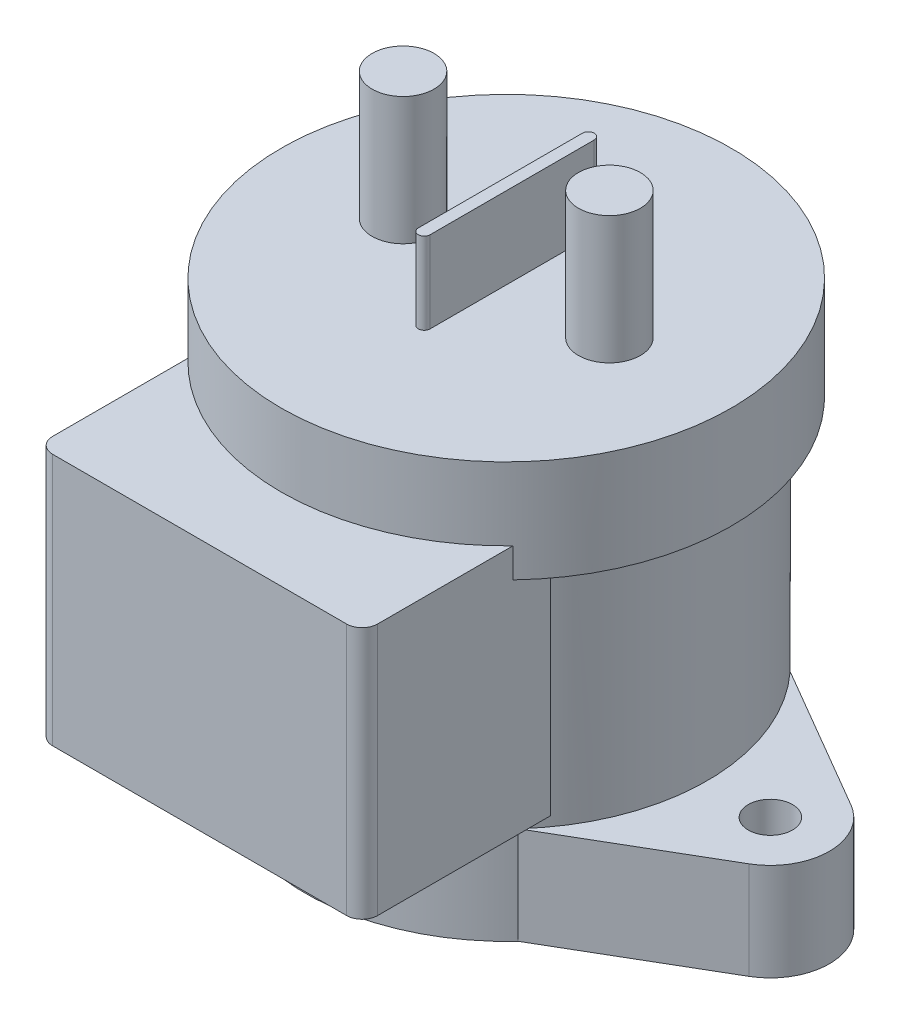
ISO-10303-21;
HEADER;
FILE_DESCRIPTION(('STEP AP214'),'2;1');
FILE_NAME('part.step','',(''),(''),'','','');
FILE_SCHEMA(('AUTOMOTIVE_DESIGN { 1 0 10303 214 1 1 1 1 }'));
ENDSEC;
DATA;
#1=APPLICATION_CONTEXT('core data for automotive mechanical design processes');
#2=APPLICATION_PROTOCOL_DEFINITION('international standard','automotive_design',2000,#1);
#3=PRODUCT_CONTEXT('',#1,'mechanical');
#4=PRODUCT('Part','Part','',(#3));
#5=PRODUCT_RELATED_PRODUCT_CATEGORY('part','',(#4));
#6=PRODUCT_DEFINITION_FORMATION('','',#4);
#7=PRODUCT_DEFINITION_CONTEXT('part definition',#1,'design');
#8=PRODUCT_DEFINITION('design','',#6,#7);
#9=PRODUCT_DEFINITION_SHAPE('','',#8);
#10=(LENGTH_UNIT() NAMED_UNIT(*) SI_UNIT(.MILLI.,.METRE.));
#11=(NAMED_UNIT(*) PLANE_ANGLE_UNIT() SI_UNIT($,.RADIAN.));
#12=(NAMED_UNIT(*) SI_UNIT($,.STERADIAN.) SOLID_ANGLE_UNIT());
#13=UNCERTAINTY_MEASURE_WITH_UNIT(LENGTH_MEASURE(1.E-05),#10,'distance_accuracy_value','');
#14=(GEOMETRIC_REPRESENTATION_CONTEXT(3) GLOBAL_UNCERTAINTY_ASSIGNED_CONTEXT((#13)) GLOBAL_UNIT_ASSIGNED_CONTEXT((#10,
#11,#12)) REPRESENTATION_CONTEXT('',''));
#15=CARTESIAN_POINT('',(0.,0.,0.));
#16=DIRECTION('',(0.,0.,1.));
#17=DIRECTION('',(1.,0.,0.));
#18=AXIS2_PLACEMENT_3D('',#15,#16,#17);
#19=CARTESIAN_POINT('',(0.,0.,0.));
#20=DIRECTION('',(0.,1.,0.));
#21=DIRECTION('',(0.,0.,1.));
#22=AXIS2_PLACEMENT_3D('',#19,#20,#21);
#23=PLANE('',#22);
#24=CARTESIAN_POINT('',(-13.335,0.,0.));
#25=DIRECTION('',(0.,1.,0.));
#26=DIRECTION('',(0.,0.,-1.));
#27=AXIS2_PLACEMENT_3D('',#24,#25,#26);
#28=CIRCLE('',#27,4.);
#29=CARTESIAN_POINT('',(-13.335,0.,-4.));
#30=VERTEX_POINT('',#29);
#31=EDGE_CURVE('E257',#30,#30,#28,.T.);
#32=ORIENTED_EDGE('',*,*,#31,.F.);
#33=EDGE_LOOP('',(#32));
#34=FACE_BOUND('',#33,.T.);
#35=CARTESIAN_POINT('',(0.,0.,0.));
#36=DIRECTION('',(0.,1.,0.));
#37=DIRECTION('',(0.,0.,1.));
#38=AXIS2_PLACEMENT_3D('',#35,#36,#37);
#39=CIRCLE('',#38,29.095);
#40=CARTESIAN_POINT('',(0.,0.,29.095));
#41=VERTEX_POINT('',#40);
#42=EDGE_CURVE('E345',#41,#41,#39,.T.);
#43=ORIENTED_EDGE('',*,*,#42,.T.);
#44=EDGE_LOOP('',(#43));
#45=FACE_BOUND('',#44,.T.);
#46=CARTESIAN_POINT('',(13.335,0.,0.));
#47=DIRECTION('',(0.,1.,0.));
#48=DIRECTION('',(0.,0.,1.));
#49=AXIS2_PLACEMENT_3D('',#46,#47,#48);
#50=CIRCLE('',#49,4.);
#51=CARTESIAN_POINT('',(13.335,0.,4.));
#52=VERTEX_POINT('',#51);
#53=EDGE_CURVE('E261',#52,#52,#50,.T.);
#54=ORIENTED_EDGE('',*,*,#53,.F.);
#55=EDGE_LOOP('',(#54));
#56=FACE_BOUND('',#55,.T.);
#57=DIRECTION('',(0.,0.,-1.));
#58=VECTOR('',#57,1.);
#59=CARTESIAN_POINT('',(0.762,0.,-10.603000190747));
#60=LINE('',#59,#58);
#61=CARTESIAN_POINT('',(0.762,0.,10.603000190747));
#62=VERTEX_POINT('',#61);
#63=CARTESIAN_POINT('',(0.762,0.,-10.603000190747));
#64=VERTEX_POINT('',#63);
#65=EDGE_CURVE('E242',#62,#64,#60,.T.);
#66=ORIENTED_EDGE('',*,*,#65,.F.);
#67=CARTESIAN_POINT('',(0.,0.,10.603));
#68=DIRECTION('',(0.,1.,0.));
#69=DIRECTION('',(0.,0.,-1.));
#70=AXIS2_PLACEMENT_3D('',#67,#68,#69);
#71=CIRCLE('',#70,0.762000000000024);
#72=CARTESIAN_POINT('',(-0.762,0.,10.603000190747));
#73=VERTEX_POINT('',#72);
#74=EDGE_CURVE('E228',#73,#62,#71,.T.);
#75=ORIENTED_EDGE('',*,*,#74,.F.);
#76=DIRECTION('',(0.,0.,1.));
#77=VECTOR('',#76,1.);
#78=CARTESIAN_POINT('',(-0.762,0.,-10.603000190747));
#79=LINE('',#78,#77);
#80=CARTESIAN_POINT('',(-0.762,0.,-10.603000190747));
#81=VERTEX_POINT('',#80);
#82=EDGE_CURVE('E233',#81,#73,#79,.T.);
#83=ORIENTED_EDGE('',*,*,#82,.F.);
#84=CARTESIAN_POINT('',(0.,0.,-10.603));
#85=DIRECTION('',(0.,1.,0.));
#86=DIRECTION('',(0.,0.,1.));
#87=AXIS2_PLACEMENT_3D('',#84,#85,#86);
#88=CIRCLE('',#87,0.762000000000024);
#89=EDGE_CURVE('E244',#64,#81,#88,.T.);
#90=ORIENTED_EDGE('',*,*,#89,.F.);
#91=EDGE_LOOP('',(#66,#75,#83,#90));
#92=FACE_BOUND('',#91,.T.);
#93=ADVANCED_FACE('F35',(#34,#45,#56,#92),#23,.T.);
#94=CARTESIAN_POINT('',(0.,-13.208,0.));
#95=DIRECTION('',(0.,1.,0.));
#96=DIRECTION('',(0.,0.,1.));
#97=AXIS2_PLACEMENT_3D('',#94,#95,#96);
#98=PLANE('',#97);
#99=CARTESIAN_POINT('',(0.,-13.208,0.));
#100=DIRECTION('',(0.,1.,0.));
#101=DIRECTION('',(0.,0.,1.));
#102=AXIS2_PLACEMENT_3D('',#99,#100,#101);
#103=CIRCLE('',#102,25.97);
#104=CARTESIAN_POINT('',(-21.,-13.208,15.2787728564829));
#105=VERTEX_POINT('',#104);
#106=CARTESIAN_POINT('',(21.,-13.208,15.2787728564829));
#107=VERTEX_POINT('',#106);
#108=EDGE_CURVE('E348',#105,#107,#103,.F.);
#109=ORIENTED_EDGE('',*,*,#108,.F.);
#110=DIRECTION('',(0.,0.,1.));
#111=VECTOR('',#110,1.);
#112=CARTESIAN_POINT('',(-21.,-13.208,0.));
#113=LINE('',#112,#111);
#114=CARTESIAN_POINT('',(-21.,-13.208,20.137502948479));
#115=VERTEX_POINT('',#114);
#116=EDGE_CURVE('E226',#105,#115,#113,.T.);
#117=ORIENTED_EDGE('',*,*,#116,.T.);
#118=CARTESIAN_POINT('',(0.,-13.208,0.));
#119=DIRECTION('',(0.,1.,0.));
#120=DIRECTION('',(0.,0.,1.));
#121=AXIS2_PLACEMENT_3D('',#118,#119,#120);
#122=CIRCLE('',#121,29.095);
#123=CARTESIAN_POINT('',(21.,-13.208,20.137502948479));
#124=VERTEX_POINT('',#123);
#125=EDGE_CURVE('E346',#124,#115,#122,.T.);
#126=ORIENTED_EDGE('',*,*,#125,.F.);
#127=DIRECTION('',(0.,0.,-1.));
#128=VECTOR('',#127,1.);
#129=CARTESIAN_POINT('',(21.,-13.208,0.));
#130=LINE('',#129,#128);
#131=EDGE_CURVE('E223',#124,#107,#130,.T.);
#132=ORIENTED_EDGE('',*,*,#131,.T.);
#133=EDGE_LOOP('',(#109,#117,#126,#132));
#134=FACE_BOUND('',#133,.T.);
#135=ADVANCED_FACE('F363',(#134),#98,.F.);
#136=CARTESIAN_POINT('',(0.,-13.208,0.));
#137=DIRECTION('',(0.,1.,0.));
#138=DIRECTION('',(0.,0.,1.));
#139=AXIS2_PLACEMENT_3D('',#136,#137,#138);
#140=CYLINDRICAL_SURFACE('',#139,29.095);
#141=DIRECTION('',(0.,1.,0.));
#142=VECTOR('',#141,1.);
#143=CARTESIAN_POINT('',(-21.,-13.208,20.137502948479));
#144=LINE('',#143,#142);
#145=CARTESIAN_POINT('',(-21.,-9.398,20.137502948479));
#146=VERTEX_POINT('',#145);
#147=EDGE_CURVE('E50',#146,#115,#144,.F.);
#148=ORIENTED_EDGE('',*,*,#147,.F.);
#149=CARTESIAN_POINT('',(0.,-9.398,0.));
#150=DIRECTION('',(0.,1.,0.));
#151=DIRECTION('',(0.,0.,1.));
#152=AXIS2_PLACEMENT_3D('',#149,#150,#151);
#153=CIRCLE('',#152,29.095);
#154=CARTESIAN_POINT('',(21.,-9.398,20.137502948479));
#155=VERTEX_POINT('',#154);
#156=EDGE_CURVE('E11',#155,#146,#153,.F.);
#157=ORIENTED_EDGE('',*,*,#156,.F.);
#158=DIRECTION('',(0.,1.,0.));
#159=VECTOR('',#158,1.);
#160=CARTESIAN_POINT('',(21.,-13.208,20.137502948479));
#161=LINE('',#160,#159);
#162=EDGE_CURVE('E175',#124,#155,#161,.T.);
#163=ORIENTED_EDGE('',*,*,#162,.F.);
#164=ORIENTED_EDGE('',*,*,#125,.T.);
#165=EDGE_LOOP('',(#148,#157,#163,#164));
#166=FACE_BOUND('',#165,.T.);
#167=ORIENTED_EDGE('',*,*,#42,.F.);
#168=EDGE_LOOP('',(#167));
#169=FACE_BOUND('',#168,.T.);
#170=ADVANCED_FACE('F37',(#166,#169),#140,.T.);
#171=CARTESIAN_POINT('',(0.,-55.88,0.));
#172=DIRECTION('',(0.,1.,0.));
#173=DIRECTION('',(0.,0.,1.));
#174=AXIS2_PLACEMENT_3D('',#171,#172,#173);
#175=CYLINDRICAL_SURFACE('',#174,25.97);
#176=CARTESIAN_POINT('',(0.,-43.28,0.));
#177=DIRECTION('',(0.,1.,0.));
#178=DIRECTION('',(0.,0.,-1.));
#179=AXIS2_PLACEMENT_3D('',#176,#177,#178);
#180=CIRCLE('',#179,25.97);
#181=CARTESIAN_POINT('',(-19.106291889061,-43.28,-17.5895));
#182=VERTEX_POINT('',#181);
#183=CARTESIAN_POINT('',(-19.106291889061,-43.28,17.5895));
#184=VERTEX_POINT('',#183);
#185=EDGE_CURVE('E283',#182,#184,#180,.T.);
#186=ORIENTED_EDGE('',*,*,#185,.T.);
#187=DIRECTION('',(0.,-1.,0.));
#188=VECTOR('',#187,1.);
#189=CARTESIAN_POINT('',(-19.106291889061,-43.28,17.5895));
#190=LINE('',#189,#188);
#191=CARTESIAN_POINT('',(-19.106291889061,-55.88,17.5895));
#192=VERTEX_POINT('',#191);
#193=EDGE_CURVE('E299',#184,#192,#190,.T.);
#194=ORIENTED_EDGE('',*,*,#193,.T.);
#195=CARTESIAN_POINT('',(0.,-55.88,0.));
#196=DIRECTION('',(0.,-1.,0.));
#197=DIRECTION('',(0.,0.,-1.));
#198=AXIS2_PLACEMENT_3D('',#195,#196,#197);
#199=CIRCLE('',#198,25.97);
#200=CARTESIAN_POINT('',(19.106291889061,-55.88,17.5895));
#201=VERTEX_POINT('',#200);
#202=EDGE_CURVE('E342',#201,#192,#199,.T.);
#203=ORIENTED_EDGE('',*,*,#202,.F.);
#204=DIRECTION('',(0.,-1.,0.));
#205=VECTOR('',#204,1.);
#206=CARTESIAN_POINT('',(19.106291889061,-43.28,17.5895));
#207=LINE('',#206,#205);
#208=CARTESIAN_POINT('',(19.106291889061,-43.28,17.5895));
#209=VERTEX_POINT('',#208);
#210=EDGE_CURVE('E332',#209,#201,#207,.T.);
#211=ORIENTED_EDGE('',*,*,#210,.F.);
#212=CARTESIAN_POINT('',(0.,-43.28,0.));
#213=DIRECTION('',(0.,1.,0.));
#214=DIRECTION('',(0.,0.,1.));
#215=AXIS2_PLACEMENT_3D('',#212,#213,#214);
#216=CIRCLE('',#215,25.97);
#217=CARTESIAN_POINT('',(19.106291889061,-43.28,-17.5895));
#218=VERTEX_POINT('',#217);
#219=EDGE_CURVE('E312',#209,#218,#216,.T.);
#220=ORIENTED_EDGE('',*,*,#219,.T.);
#221=DIRECTION('',(0.,-1.,0.));
#222=VECTOR('',#221,1.);
#223=CARTESIAN_POINT('',(19.106291889061,-43.28,-17.5895));
#224=LINE('',#223,#222);
#225=CARTESIAN_POINT('',(19.106291889061,-55.88,-17.5895));
#226=VERTEX_POINT('',#225);
#227=EDGE_CURVE('E325',#218,#226,#224,.T.);
#228=ORIENTED_EDGE('',*,*,#227,.T.);
#229=CARTESIAN_POINT('',(-19.1062918890611,-55.88,-17.5895));
#230=VERTEX_POINT('',#229);
#231=EDGE_CURVE('E335',#230,#226,#199,.T.);
#232=ORIENTED_EDGE('',*,*,#231,.F.);
#233=DIRECTION('',(0.,-1.,0.));
#234=VECTOR('',#233,1.);
#235=CARTESIAN_POINT('',(-19.106291889061,-43.28,-17.5895));
#236=LINE('',#235,#234);
#237=EDGE_CURVE('E302',#182,#230,#236,.T.);
#238=ORIENTED_EDGE('',*,*,#237,.F.);
#239=EDGE_LOOP('',(#186,#194,#203,#211,#220,#228,#232,#238));
#240=FACE_BOUND('',#239,.T.);
#241=CARTESIAN_POINT('',(0.,-42.037,0.));
#242=DIRECTION('',(0.,1.,0.));
#243=DIRECTION('',(0.,0.,1.));
#244=AXIS2_PLACEMENT_3D('',#241,#242,#243);
#245=CIRCLE('',#244,25.97);
#246=CARTESIAN_POINT('',(-21.,-42.037,15.278772856483));
#247=VERTEX_POINT('',#246);
#248=CARTESIAN_POINT('',(21.,-42.037,15.278772856483));
#249=VERTEX_POINT('',#248);
#250=EDGE_CURVE('E203',#247,#249,#245,.T.);
#251=ORIENTED_EDGE('',*,*,#250,.F.);
#252=DIRECTION('',(0.,1.,0.));
#253=VECTOR('',#252,1.);
#254=CARTESIAN_POINT('',(-21.,-55.88,15.2787728564829));
#255=LINE('',#254,#253);
#256=EDGE_CURVE('E43',#247,#105,#255,.T.);
#257=ORIENTED_EDGE('',*,*,#256,.T.);
#258=ORIENTED_EDGE('',*,*,#108,.T.);
#259=DIRECTION('',(0.,1.,0.));
#260=VECTOR('',#259,1.);
#261=CARTESIAN_POINT('',(21.,-55.88,15.2787728564829));
#262=LINE('',#261,#260);
#263=EDGE_CURVE('E353',#107,#249,#262,.F.);
#264=ORIENTED_EDGE('',*,*,#263,.T.);
#265=EDGE_LOOP('',(#251,#257,#258,#264));
#266=FACE_BOUND('',#265,.T.);
#267=ADVANCED_FACE('F357',(#240,#266),#175,.T.);
#268=CARTESIAN_POINT('',(0.,-55.88,0.));
#269=DIRECTION('',(0.,-1.,0.));
#270=DIRECTION('',(0.,0.,-1.));
#271=AXIS2_PLACEMENT_3D('',#268,#269,#270);
#272=PLANE('',#271);
#273=ORIENTED_EDGE('',*,*,#202,.T.);
#274=DIRECTION('',(-0.863816050494099,0.,-0.503807335108151));
#275=VECTOR('',#274,1.);
#276=CARTESIAN_POINT('',(-37.9790118935241,-55.88,6.58227830476502));
#277=LINE('',#276,#275);
#278=CARTESIAN_POINT('',(-37.9790118935241,-55.88,6.58227830476502));
#279=VERTEX_POINT('',#278);
#280=EDGE_CURVE('E280',#192,#279,#277,.T.);
#281=ORIENTED_EDGE('',*,*,#280,.T.);
#282=CARTESIAN_POINT('',(-34.14,-55.88,0.));
#283=DIRECTION('',(0.,-1.,0.));
#284=DIRECTION('',(0.,0.,1.));
#285=AXIS2_PLACEMENT_3D('',#282,#283,#284);
#286=CIRCLE('',#285,7.62000000000001);
#287=CARTESIAN_POINT('',(-37.9790118935241,-55.88,-6.58227830476502));
#288=VERTEX_POINT('',#287);
#289=EDGE_CURVE('E273',#279,#288,#286,.T.);
#290=ORIENTED_EDGE('',*,*,#289,.T.);
#291=DIRECTION('',(0.863816050494099,0.,-0.503807335108151));
#292=VECTOR('',#291,1.);
#293=CARTESIAN_POINT('',(-37.9790118935241,-55.88,-6.58227830476502));
#294=LINE('',#293,#292);
#295=EDGE_CURVE('E292',#288,#230,#294,.T.);
#296=ORIENTED_EDGE('',*,*,#295,.T.);
#297=ORIENTED_EDGE('',*,*,#231,.T.);
#298=DIRECTION('',(0.863816050494099,0.,0.503807335108151));
#299=VECTOR('',#298,1.);
#300=CARTESIAN_POINT('',(37.9790118935241,-55.88,-6.58227830476503));
#301=LINE('',#300,#299);
#302=CARTESIAN_POINT('',(37.9790118935241,-55.88,-6.58227830476503));
#303=VERTEX_POINT('',#302);
#304=EDGE_CURVE('E309',#226,#303,#301,.T.);
#305=ORIENTED_EDGE('',*,*,#304,.T.);
#306=CARTESIAN_POINT('',(34.14,-55.88,0.));
#307=DIRECTION('',(0.,-1.,0.));
#308=DIRECTION('',(0.,0.,-1.));
#309=AXIS2_PLACEMENT_3D('',#306,#307,#308);
#310=CIRCLE('',#309,7.62);
#311=CARTESIAN_POINT('',(37.9790118935241,-55.88,6.58227830476506));
#312=VERTEX_POINT('',#311);
#313=EDGE_CURVE('E328',#303,#312,#310,.T.);
#314=ORIENTED_EDGE('',*,*,#313,.T.);
#315=DIRECTION('',(-0.863816050494099,0.,0.503807335108151));
#316=VECTOR('',#315,1.);
#317=CARTESIAN_POINT('',(37.9790118935241,-55.88,6.58227830476503));
#318=LINE('',#317,#316);
#319=EDGE_CURVE('E316',#312,#201,#318,.T.);
#320=ORIENTED_EDGE('',*,*,#319,.T.);
#321=EDGE_LOOP('',(#273,#281,#290,#296,#297,#305,#314,#320));
#322=FACE_BOUND('',#321,.T.);
#323=CARTESIAN_POINT('',(34.14,-55.88,0.));
#324=DIRECTION('',(0.,-1.,0.));
#325=DIRECTION('',(0.,0.,-1.));
#326=AXIS2_PLACEMENT_3D('',#323,#324,#325);
#327=CIRCLE('',#326,2.86);
#328=CARTESIAN_POINT('',(34.14,-55.88,-2.85999999999996));
#329=VERTEX_POINT('',#328);
#330=EDGE_CURVE('E298',#329,#329,#327,.T.);
#331=ORIENTED_EDGE('',*,*,#330,.F.);
#332=EDGE_LOOP('',(#331));
#333=FACE_BOUND('',#332,.T.);
#334=CARTESIAN_POINT('',(-34.14,-55.88,0.));
#335=DIRECTION('',(0.,-1.,0.));
#336=DIRECTION('',(0.,0.,1.));
#337=AXIS2_PLACEMENT_3D('',#334,#335,#336);
#338=CIRCLE('',#337,2.86);
#339=CARTESIAN_POINT('',(-34.14,-55.88,2.86000000000003));
#340=VERTEX_POINT('',#339);
#341=EDGE_CURVE('E267',#340,#340,#338,.T.);
#342=ORIENTED_EDGE('',*,*,#341,.F.);
#343=EDGE_LOOP('',(#342));
#344=FACE_BOUND('',#343,.T.);
#345=ADVANCED_FACE('F395',(#322,#333,#344),#272,.T.);
#346=CARTESIAN_POINT('',(37.9790118935241,-43.28,6.58227830476503));
#347=DIRECTION('',(0.503807335108151,0.,0.863816050494099));
#348=DIRECTION('',(0.863816050494099,0.,-0.503807335108151));
#349=AXIS2_PLACEMENT_3D('',#346,#347,#348);
#350=PLANE('',#349);
#351=ORIENTED_EDGE('',*,*,#319,.F.);
#352=DIRECTION('',(0.,-1.,0.));
#353=VECTOR('',#352,1.);
#354=CARTESIAN_POINT('',(37.9790118935241,-43.28,6.58227830476506));
#355=LINE('',#354,#353);
#356=CARTESIAN_POINT('',(37.9790118935241,-43.28,6.58227830476506));
#357=VERTEX_POINT('',#356);
#358=EDGE_CURVE('E336',#357,#312,#355,.T.);
#359=ORIENTED_EDGE('',*,*,#358,.F.);
#360=DIRECTION('',(-0.863816050494099,0.,0.503807335108151));
#361=VECTOR('',#360,1.);
#362=CARTESIAN_POINT('',(37.9790118935241,-43.28,6.58227830476503));
#363=LINE('',#362,#361);
#364=EDGE_CURVE('E322',#357,#209,#363,.T.);
#365=ORIENTED_EDGE('',*,*,#364,.T.);
#366=ORIENTED_EDGE('',*,*,#210,.T.);
#367=EDGE_LOOP('',(#351,#359,#365,#366));
#368=FACE_BOUND('',#367,.T.);
#369=ADVANCED_FACE('F399',(#368),#350,.T.);
#370=CARTESIAN_POINT('',(34.14,-43.28,0.));
#371=DIRECTION('',(0.,-1.,0.));
#372=DIRECTION('',(0.,0.,-1.));
#373=AXIS2_PLACEMENT_3D('',#370,#371,#372);
#374=CYLINDRICAL_SURFACE('',#373,7.62);
#375=ORIENTED_EDGE('',*,*,#313,.F.);
#376=DIRECTION('',(0.,-1.,0.));
#377=VECTOR('',#376,1.);
#378=CARTESIAN_POINT('',(37.9790118935241,-43.28,-6.58227830476503));
#379=LINE('',#378,#377);
#380=CARTESIAN_POINT('',(37.9790118935241,-43.28,-6.58227830476503));
#381=VERTEX_POINT('',#380);
#382=EDGE_CURVE('E338',#381,#303,#379,.T.);
#383=ORIENTED_EDGE('',*,*,#382,.F.);
#384=CARTESIAN_POINT('',(34.14,-43.28,0.));
#385=DIRECTION('',(0.,-1.,0.));
#386=DIRECTION('',(0.,0.,-1.));
#387=AXIS2_PLACEMENT_3D('',#384,#385,#386);
#388=CIRCLE('',#387,7.62);
#389=EDGE_CURVE('E319',#381,#357,#388,.T.);
#390=ORIENTED_EDGE('',*,*,#389,.T.);
#391=ORIENTED_EDGE('',*,*,#358,.T.);
#392=EDGE_LOOP('',(#375,#383,#390,#391));
#393=FACE_BOUND('',#392,.T.);
#394=ADVANCED_FACE('F405',(#393),#374,.T.);
#395=CARTESIAN_POINT('',(37.9790118935241,-43.28,-6.58227830476503));
#396=DIRECTION('',(0.503807335108151,0.,-0.863816050494099));
#397=DIRECTION('',(-0.863816050494099,0.,-0.503807335108151));
#398=AXIS2_PLACEMENT_3D('',#395,#396,#397);
#399=PLANE('',#398);
#400=ORIENTED_EDGE('',*,*,#304,.F.);
#401=ORIENTED_EDGE('',*,*,#227,.F.);
#402=DIRECTION('',(0.863816050494099,0.,0.503807335108151));
#403=VECTOR('',#402,1.);
#404=CARTESIAN_POINT('',(37.9790118935241,-43.28,-6.58227830476503));
#405=LINE('',#404,#403);
#406=EDGE_CURVE('E315',#218,#381,#405,.T.);
#407=ORIENTED_EDGE('',*,*,#406,.T.);
#408=ORIENTED_EDGE('',*,*,#382,.T.);
#409=EDGE_LOOP('',(#400,#401,#407,#408));
#410=FACE_BOUND('',#409,.T.);
#411=ADVANCED_FACE('F401',(#410),#399,.T.);
#412=CARTESIAN_POINT('',(0.,-43.28,0.));
#413=DIRECTION('',(0.,1.,0.));
#414=DIRECTION('',(0.,0.,1.));
#415=AXIS2_PLACEMENT_3D('',#412,#413,#414);
#416=PLANE('',#415);
#417=CARTESIAN_POINT('',(34.14,-43.28,0.));
#418=DIRECTION('',(0.,-1.,0.));
#419=DIRECTION('',(0.,0.,-1.));
#420=AXIS2_PLACEMENT_3D('',#417,#418,#419);
#421=CIRCLE('',#420,2.86);
#422=CARTESIAN_POINT('',(34.14,-43.28,-2.85999999999996));
#423=VERTEX_POINT('',#422);
#424=EDGE_CURVE('E306',#423,#423,#421,.T.);
#425=ORIENTED_EDGE('',*,*,#424,.T.);
#426=EDGE_LOOP('',(#425));
#427=FACE_BOUND('',#426,.T.);
#428=ORIENTED_EDGE('',*,*,#219,.F.);
#429=ORIENTED_EDGE('',*,*,#364,.F.);
#430=ORIENTED_EDGE('',*,*,#389,.F.);
#431=ORIENTED_EDGE('',*,*,#406,.F.);
#432=EDGE_LOOP('',(#428,#429,#430,#431));
#433=FACE_BOUND('',#432,.T.);
#434=ADVANCED_FACE('F404',(#427,#433),#416,.T.);
#435=CARTESIAN_POINT('',(34.14,-43.28,0.));
#436=DIRECTION('',(0.,-1.,0.));
#437=DIRECTION('',(0.,0.,-1.));
#438=AXIS2_PLACEMENT_3D('',#435,#436,#437);
#439=CYLINDRICAL_SURFACE('',#438,2.86);
#440=ORIENTED_EDGE('',*,*,#424,.F.);
#441=EDGE_LOOP('',(#440));
#442=FACE_BOUND('',#441,.T.);
#443=ORIENTED_EDGE('',*,*,#330,.T.);
#444=EDGE_LOOP('',(#443));
#445=FACE_BOUND('',#444,.T.);
#446=ADVANCED_FACE('F415',(#442,#445),#439,.F.);
#447=CARTESIAN_POINT('',(-34.14,-43.28,0.));
#448=DIRECTION('',(0.,-1.,0.));
#449=DIRECTION('',(0.,0.,-1.));
#450=AXIS2_PLACEMENT_3D('',#447,#448,#449);
#451=CYLINDRICAL_SURFACE('',#450,7.62000000000001);
#452=ORIENTED_EDGE('',*,*,#289,.F.);
#453=DIRECTION('',(0.,-1.,0.));
#454=VECTOR('',#453,1.);
#455=CARTESIAN_POINT('',(-37.9790118935241,-43.28,6.58227830476502));
#456=LINE('',#455,#454);
#457=CARTESIAN_POINT('',(-37.9790118935241,-43.28,6.58227830476502));
#458=VERTEX_POINT('',#457);
#459=EDGE_CURVE('E296',#458,#279,#456,.T.);
#460=ORIENTED_EDGE('',*,*,#459,.F.);
#461=CARTESIAN_POINT('',(-34.14,-43.28,0.));
#462=DIRECTION('',(0.,-1.,0.));
#463=DIRECTION('',(0.,0.,1.));
#464=AXIS2_PLACEMENT_3D('',#461,#462,#463);
#465=CIRCLE('',#464,7.62000000000001);
#466=CARTESIAN_POINT('',(-37.9790118935241,-43.28,-6.58227830476502));
#467=VERTEX_POINT('',#466);
#468=EDGE_CURVE('E276',#458,#467,#465,.T.);
#469=ORIENTED_EDGE('',*,*,#468,.T.);
#470=DIRECTION('',(0.,-1.,0.));
#471=VECTOR('',#470,1.);
#472=CARTESIAN_POINT('',(-37.9790118935241,-43.28,-6.58227830476502));
#473=LINE('',#472,#471);
#474=EDGE_CURVE('E289',#467,#288,#473,.T.);
#475=ORIENTED_EDGE('',*,*,#474,.T.);
#476=EDGE_LOOP('',(#452,#460,#469,#475));
#477=FACE_BOUND('',#476,.T.);
#478=ADVANCED_FACE('F419',(#477),#451,.T.);
#479=CARTESIAN_POINT('',(-37.9790118935241,-43.28,6.58227830476502));
#480=DIRECTION('',(-0.503807335108151,0.,0.863816050494098));
#481=DIRECTION('',(0.863816050494099,0.,0.503807335108151));
#482=AXIS2_PLACEMENT_3D('',#479,#480,#481);
#483=PLANE('',#482);
#484=ORIENTED_EDGE('',*,*,#280,.F.);
#485=ORIENTED_EDGE('',*,*,#193,.F.);
#486=DIRECTION('',(-0.863816050494099,0.,-0.503807335108151));
#487=VECTOR('',#486,1.);
#488=CARTESIAN_POINT('',(-37.9790118935241,-43.28,6.58227830476502));
#489=LINE('',#488,#487);
#490=EDGE_CURVE('E286',#184,#458,#489,.T.);
#491=ORIENTED_EDGE('',*,*,#490,.T.);
#492=ORIENTED_EDGE('',*,*,#459,.T.);
#493=EDGE_LOOP('',(#484,#485,#491,#492));
#494=FACE_BOUND('',#493,.T.);
#495=ADVANCED_FACE('F423',(#494),#483,.T.);
#496=CARTESIAN_POINT('',(-37.9790118935241,-43.28,-6.58227830476502));
#497=DIRECTION('',(-0.503807335108151,0.,-0.863816050494098));
#498=DIRECTION('',(-0.863816050494099,0.,0.503807335108151));
#499=AXIS2_PLACEMENT_3D('',#496,#497,#498);
#500=PLANE('',#499);
#501=ORIENTED_EDGE('',*,*,#295,.F.);
#502=ORIENTED_EDGE('',*,*,#474,.F.);
#503=DIRECTION('',(0.863816050494099,0.,-0.503807335108151));
#504=VECTOR('',#503,1.);
#505=CARTESIAN_POINT('',(-37.9790118935241,-43.28,-6.58227830476502));
#506=LINE('',#505,#504);
#507=EDGE_CURVE('E279',#467,#182,#506,.T.);
#508=ORIENTED_EDGE('',*,*,#507,.T.);
#509=ORIENTED_EDGE('',*,*,#237,.T.);
#510=EDGE_LOOP('',(#501,#502,#508,#509));
#511=FACE_BOUND('',#510,.T.);
#512=ADVANCED_FACE('F425',(#511),#500,.T.);
#513=CARTESIAN_POINT('',(-34.14,-43.28,0.));
#514=DIRECTION('',(0.,1.,0.));
#515=DIRECTION('',(0.,0.,1.));
#516=AXIS2_PLACEMENT_3D('',#513,#514,#515);
#517=PLANE('',#516);
#518=CARTESIAN_POINT('',(-34.14,-43.28,0.));
#519=DIRECTION('',(0.,-1.,0.));
#520=DIRECTION('',(0.,0.,1.));
#521=AXIS2_PLACEMENT_3D('',#518,#519,#520);
#522=CIRCLE('',#521,2.86);
#523=CARTESIAN_POINT('',(-34.14,-43.28,2.86000000000003));
#524=VERTEX_POINT('',#523);
#525=EDGE_CURVE('E270',#524,#524,#522,.T.);
#526=ORIENTED_EDGE('',*,*,#525,.T.);
#527=EDGE_LOOP('',(#526));
#528=FACE_BOUND('',#527,.T.);
#529=ORIENTED_EDGE('',*,*,#468,.F.);
#530=ORIENTED_EDGE('',*,*,#490,.F.);
#531=ORIENTED_EDGE('',*,*,#185,.F.);
#532=ORIENTED_EDGE('',*,*,#507,.F.);
#533=EDGE_LOOP('',(#529,#530,#531,#532));
#534=FACE_BOUND('',#533,.T.);
#535=ADVANCED_FACE('F428',(#528,#534),#517,.T.);
#536=CARTESIAN_POINT('',(-34.14,-43.28,0.));
#537=DIRECTION('',(0.,-1.,0.));
#538=DIRECTION('',(0.,0.,-1.));
#539=AXIS2_PLACEMENT_3D('',#536,#537,#538);
#540=CYLINDRICAL_SURFACE('',#539,2.86);
#541=ORIENTED_EDGE('',*,*,#525,.F.);
#542=EDGE_LOOP('',(#541));
#543=FACE_BOUND('',#542,.T.);
#544=ORIENTED_EDGE('',*,*,#341,.T.);
#545=EDGE_LOOP('',(#544));
#546=FACE_BOUND('',#545,.T.);
#547=ADVANCED_FACE('F435',(#543,#546),#540,.F.);
#548=CARTESIAN_POINT('',(13.335,16.49,0.));
#549=DIRECTION('',(0.,-1.,0.));
#550=DIRECTION('',(0.,0.,-1.));
#551=AXIS2_PLACEMENT_3D('',#548,#549,#550);
#552=CYLINDRICAL_SURFACE('',#551,4.);
#553=CARTESIAN_POINT('',(13.335,16.49,0.));
#554=DIRECTION('',(0.,1.,0.));
#555=DIRECTION('',(0.,0.,1.));
#556=AXIS2_PLACEMENT_3D('',#553,#554,#555);
#557=CIRCLE('',#556,4.);
#558=CARTESIAN_POINT('',(13.335,16.49,4.));
#559=VERTEX_POINT('',#558);
#560=EDGE_CURVE('E264',#559,#559,#557,.T.);
#561=ORIENTED_EDGE('',*,*,#560,.F.);
#562=EDGE_LOOP('',(#561));
#563=FACE_BOUND('',#562,.T.);
#564=ORIENTED_EDGE('',*,*,#53,.T.);
#565=EDGE_LOOP('',(#564));
#566=FACE_BOUND('',#565,.T.);
#567=ADVANCED_FACE('F439',(#563,#566),#552,.T.);
#568=CARTESIAN_POINT('',(13.335,16.49,0.));
#569=DIRECTION('',(0.,1.,0.));
#570=DIRECTION('',(0.,0.,1.));
#571=AXIS2_PLACEMENT_3D('',#568,#569,#570);
#572=PLANE('',#571);
#573=ORIENTED_EDGE('',*,*,#560,.T.);
#574=EDGE_LOOP('',(#573));
#575=FACE_BOUND('',#574,.T.);
#576=ADVANCED_FACE('F443',(#575),#572,.T.);
#577=CARTESIAN_POINT('',(-13.335,16.49,0.));
#578=DIRECTION('',(0.,-1.,0.));
#579=DIRECTION('',(0.,0.,-1.));
#580=AXIS2_PLACEMENT_3D('',#577,#578,#579);
#581=CYLINDRICAL_SURFACE('',#580,4.);
#582=CARTESIAN_POINT('',(-13.335,16.49,0.));
#583=DIRECTION('',(0.,1.,0.));
#584=DIRECTION('',(0.,0.,-1.));
#585=AXIS2_PLACEMENT_3D('',#582,#583,#584);
#586=CIRCLE('',#585,4.);
#587=CARTESIAN_POINT('',(-13.335,16.49,-4.));
#588=VERTEX_POINT('',#587);
#589=EDGE_CURVE('E258',#588,#588,#586,.T.);
#590=ORIENTED_EDGE('',*,*,#589,.F.);
#591=EDGE_LOOP('',(#590));
#592=FACE_BOUND('',#591,.T.);
#593=ORIENTED_EDGE('',*,*,#31,.T.);
#594=EDGE_LOOP('',(#593));
#595=FACE_BOUND('',#594,.T.);
#596=ADVANCED_FACE('F447',(#592,#595),#581,.T.);
#597=CARTESIAN_POINT('',(-13.335,16.49,0.));
#598=DIRECTION('',(0.,-1.,0.));
#599=DIRECTION('',(0.,0.,-1.));
#600=AXIS2_PLACEMENT_3D('',#597,#598,#599);
#601=PLANE('',#600);
#602=ORIENTED_EDGE('',*,*,#589,.T.);
#603=EDGE_LOOP('',(#602));
#604=FACE_BOUND('',#603,.T.);
#605=ADVANCED_FACE('F451',(#604),#601,.F.);
#606=CARTESIAN_POINT('',(0.,10.541,10.603));
#607=DIRECTION('',(0.,-1.,0.));
#608=DIRECTION('',(0.,0.,-1.));
#609=AXIS2_PLACEMENT_3D('',#606,#607,#608);
#610=CYLINDRICAL_SURFACE('',#609,0.762000000000024);
#611=ORIENTED_EDGE('',*,*,#74,.T.);
#612=DIRECTION('',(0.,-1.,0.));
#613=VECTOR('',#612,1.);
#614=CARTESIAN_POINT('',(0.762,10.541,10.603000190747));
#615=LINE('',#614,#613);
#616=CARTESIAN_POINT('',(0.762,10.541,10.603000190747));
#617=VERTEX_POINT('',#616);
#618=EDGE_CURVE('E255',#617,#62,#615,.T.);
#619=ORIENTED_EDGE('',*,*,#618,.F.);
#620=CARTESIAN_POINT('',(0.,10.541,10.603));
#621=DIRECTION('',(0.,1.,0.));
#622=DIRECTION('',(0.,0.,-1.));
#623=AXIS2_PLACEMENT_3D('',#620,#621,#622);
#624=CIRCLE('',#623,0.762000000000024);
#625=CARTESIAN_POINT('',(-0.762,10.541,10.603000190747));
#626=VERTEX_POINT('',#625);
#627=EDGE_CURVE('E229',#626,#617,#624,.T.);
#628=ORIENTED_EDGE('',*,*,#627,.F.);
#629=DIRECTION('',(0.,-1.,0.));
#630=VECTOR('',#629,1.);
#631=CARTESIAN_POINT('',(-0.762,10.541,10.603000190747));
#632=LINE('',#631,#630);
#633=EDGE_CURVE('E239',#626,#73,#632,.T.);
#634=ORIENTED_EDGE('',*,*,#633,.T.);
#635=EDGE_LOOP('',(#611,#619,#628,#634));
#636=FACE_BOUND('',#635,.T.);
#637=ADVANCED_FACE('F455',(#636),#610,.T.);
#638=CARTESIAN_POINT('',(0.762,10.541,-10.603000190747));
#639=DIRECTION('',(-1.,0.,0.));
#640=DIRECTION('',(0.,0.,1.));
#641=AXIS2_PLACEMENT_3D('',#638,#639,#640);
#642=PLANE('',#641);
#643=ORIENTED_EDGE('',*,*,#65,.T.);
#644=DIRECTION('',(0.,-1.,0.));
#645=VECTOR('',#644,1.);
#646=CARTESIAN_POINT('',(0.762,10.541,-10.603000190747));
#647=LINE('',#646,#645);
#648=CARTESIAN_POINT('',(0.762,10.541,-10.603000190747));
#649=VERTEX_POINT('',#648);
#650=EDGE_CURVE('E252',#649,#64,#647,.T.);
#651=ORIENTED_EDGE('',*,*,#650,.F.);
#652=DIRECTION('',(0.,0.,-1.));
#653=VECTOR('',#652,1.);
#654=CARTESIAN_POINT('',(0.762,10.541,-10.603000190747));
#655=LINE('',#654,#653);
#656=EDGE_CURVE('E232',#617,#649,#655,.T.);
#657=ORIENTED_EDGE('',*,*,#656,.F.);
#658=ORIENTED_EDGE('',*,*,#618,.T.);
#659=EDGE_LOOP('',(#643,#651,#657,#658));
#660=FACE_BOUND('',#659,.T.);
#661=ADVANCED_FACE('F459',(#660),#642,.F.);
#662=CARTESIAN_POINT('',(0.,10.541,-10.603));
#663=DIRECTION('',(0.,-1.,0.));
#664=DIRECTION('',(0.,0.,-1.));
#665=AXIS2_PLACEMENT_3D('',#662,#663,#664);
#666=CYLINDRICAL_SURFACE('',#665,0.762000000000024);
#667=ORIENTED_EDGE('',*,*,#89,.T.);
#668=DIRECTION('',(0.,-1.,0.));
#669=VECTOR('',#668,1.);
#670=CARTESIAN_POINT('',(-0.762,10.541,-10.603000190747));
#671=LINE('',#670,#669);
#672=CARTESIAN_POINT('',(-0.762,10.541,-10.603000190747));
#673=VERTEX_POINT('',#672);
#674=EDGE_CURVE('E250',#673,#81,#671,.T.);
#675=ORIENTED_EDGE('',*,*,#674,.F.);
#676=CARTESIAN_POINT('',(0.,10.541,-10.603));
#677=DIRECTION('',(0.,1.,0.));
#678=DIRECTION('',(0.,0.,1.));
#679=AXIS2_PLACEMENT_3D('',#676,#677,#678);
#680=CIRCLE('',#679,0.762000000000024);
#681=EDGE_CURVE('E235',#649,#673,#680,.T.);
#682=ORIENTED_EDGE('',*,*,#681,.F.);
#683=ORIENTED_EDGE('',*,*,#650,.T.);
#684=EDGE_LOOP('',(#667,#675,#682,#683));
#685=FACE_BOUND('',#684,.T.);
#686=ADVANCED_FACE('F463',(#685),#666,.T.);
#687=CARTESIAN_POINT('',(-0.762,10.541,-10.603000190747));
#688=DIRECTION('',(1.,0.,0.));
#689=DIRECTION('',(0.,0.,-1.));
#690=AXIS2_PLACEMENT_3D('',#687,#688,#689);
#691=PLANE('',#690);
#692=ORIENTED_EDGE('',*,*,#82,.T.);
#693=ORIENTED_EDGE('',*,*,#633,.F.);
#694=DIRECTION('',(0.,0.,1.));
#695=VECTOR('',#694,1.);
#696=CARTESIAN_POINT('',(-0.762,10.541,-10.603000190747));
#697=LINE('',#696,#695);
#698=EDGE_CURVE('E237',#673,#626,#697,.T.);
#699=ORIENTED_EDGE('',*,*,#698,.F.);
#700=ORIENTED_EDGE('',*,*,#674,.T.);
#701=EDGE_LOOP('',(#692,#693,#699,#700));
#702=FACE_BOUND('',#701,.T.);
#703=ADVANCED_FACE('F467',(#702),#691,.F.);
#704=CARTESIAN_POINT('',(0.,10.541,10.603));
#705=DIRECTION('',(0.,-1.,0.));
#706=DIRECTION('',(0.,0.,-1.));
#707=AXIS2_PLACEMENT_3D('',#704,#705,#706);
#708=PLANE('',#707);
#709=ORIENTED_EDGE('',*,*,#627,.T.);
#710=ORIENTED_EDGE('',*,*,#656,.T.);
#711=ORIENTED_EDGE('',*,*,#681,.T.);
#712=ORIENTED_EDGE('',*,*,#698,.T.);
#713=EDGE_LOOP('',(#709,#710,#711,#712));
#714=FACE_BOUND('',#713,.T.);
#715=ADVANCED_FACE('F471',(#714),#708,.F.);
#716=CARTESIAN_POINT('',(-21.,-9.398,37.63));
#717=DIRECTION('',(-1.,0.,0.));
#718=DIRECTION('',(0.,0.,1.));
#719=AXIS2_PLACEMENT_3D('',#716,#717,#718);
#720=PLANE('',#719);
#721=ORIENTED_EDGE('',*,*,#116,.F.);
#722=ORIENTED_EDGE('',*,*,#256,.F.);
#723=DIRECTION('',(0.,0.,-1.));
#724=VECTOR('',#723,1.);
#725=CARTESIAN_POINT('',(-21.,-42.037,37.63));
#726=LINE('',#725,#724);
#727=CARTESIAN_POINT('',(-21.,-42.037,37.63));
#728=VERTEX_POINT('',#727);
#729=EDGE_CURVE('E179',#728,#247,#726,.T.);
#730=ORIENTED_EDGE('',*,*,#729,.F.);
#731=DIRECTION('',(0.,-1.,0.));
#732=VECTOR('',#731,1.);
#733=CARTESIAN_POINT('',(-21.,-9.398,37.63));
#734=LINE('',#733,#732);
#735=CARTESIAN_POINT('',(-21.,-9.398,37.63));
#736=VERTEX_POINT('',#735);
#737=EDGE_CURVE('E217',#736,#728,#734,.T.);
#738=ORIENTED_EDGE('',*,*,#737,.F.);
#739=DIRECTION('',(0.,0.,-1.));
#740=VECTOR('',#739,1.);
#741=CARTESIAN_POINT('',(-21.,-9.398,37.63));
#742=LINE('',#741,#740);
#743=EDGE_CURVE('E188',#736,#146,#742,.T.);
#744=ORIENTED_EDGE('',*,*,#743,.T.);
#745=ORIENTED_EDGE('',*,*,#147,.T.);
#746=EDGE_LOOP('',(#721,#722,#730,#738,#744,#745));
#747=FACE_BOUND('',#746,.T.);
#748=ADVANCED_FACE('F365',(#747),#720,.T.);
#749=CARTESIAN_POINT('',(21.,-9.398,37.63));
#750=DIRECTION('',(1.,0.,0.));
#751=DIRECTION('',(0.,0.,-1.));
#752=AXIS2_PLACEMENT_3D('',#749,#750,#751);
#753=PLANE('',#752);
#754=ORIENTED_EDGE('',*,*,#131,.F.);
#755=ORIENTED_EDGE('',*,*,#162,.T.);
#756=DIRECTION('',(0.,0.,1.));
#757=VECTOR('',#756,1.);
#758=CARTESIAN_POINT('',(21.,-9.398,37.63));
#759=LINE('',#758,#757);
#760=CARTESIAN_POINT('',(21.,-9.398,37.63));
#761=VERTEX_POINT('',#760);
#762=EDGE_CURVE('E168',#155,#761,#759,.T.);
#763=ORIENTED_EDGE('',*,*,#762,.T.);
#764=DIRECTION('',(0.,-1.,0.));
#765=VECTOR('',#764,1.);
#766=CARTESIAN_POINT('',(21.,-9.398,37.63));
#767=LINE('',#766,#765);
#768=CARTESIAN_POINT('',(21.,-42.037,37.63));
#769=VERTEX_POINT('',#768);
#770=EDGE_CURVE('E173',#761,#769,#767,.T.);
#771=ORIENTED_EDGE('',*,*,#770,.T.);
#772=DIRECTION('',(0.,0.,1.));
#773=VECTOR('',#772,1.);
#774=CARTESIAN_POINT('',(21.,-42.037,37.63));
#775=LINE('',#774,#773);
#776=EDGE_CURVE('E206',#249,#769,#775,.T.);
#777=ORIENTED_EDGE('',*,*,#776,.F.);
#778=ORIENTED_EDGE('',*,*,#263,.F.);
#779=EDGE_LOOP('',(#754,#755,#763,#771,#777,#778));
#780=FACE_BOUND('',#779,.T.);
#781=ADVANCED_FACE('F171',(#780),#753,.T.);
#782=CARTESIAN_POINT('',(-19.,-9.398,37.63));
#783=DIRECTION('',(0.,-1.,0.));
#784=DIRECTION('',(0.,0.,-1.));
#785=AXIS2_PLACEMENT_3D('',#782,#783,#784);
#786=CYLINDRICAL_SURFACE('',#785,2.);
#787=CARTESIAN_POINT('',(-19.,-42.037,37.63));
#788=DIRECTION('',(0.,-1.,0.));
#789=DIRECTION('',(0.,0.,1.));
#790=AXIS2_PLACEMENT_3D('',#787,#788,#789);
#791=CIRCLE('',#790,2.);
#792=CARTESIAN_POINT('',(-19.,-42.037,39.63));
#793=VERTEX_POINT('',#792);
#794=EDGE_CURVE('E212',#793,#728,#791,.T.);
#795=ORIENTED_EDGE('',*,*,#794,.F.);
#796=DIRECTION('',(0.,-1.,0.));
#797=VECTOR('',#796,1.);
#798=CARTESIAN_POINT('',(-19.,-9.398,39.63));
#799=LINE('',#798,#797);
#800=CARTESIAN_POINT('',(-19.,-9.398,39.63));
#801=VERTEX_POINT('',#800);
#802=EDGE_CURVE('E219',#801,#793,#799,.T.);
#803=ORIENTED_EDGE('',*,*,#802,.F.);
#804=CARTESIAN_POINT('',(-19.,-9.398,37.63));
#805=DIRECTION('',(0.,-1.,0.));
#806=DIRECTION('',(0.,0.,1.));
#807=AXIS2_PLACEMENT_3D('',#804,#805,#806);
#808=CIRCLE('',#807,2.);
#809=EDGE_CURVE('E196',#801,#736,#808,.T.);
#810=ORIENTED_EDGE('',*,*,#809,.T.);
#811=ORIENTED_EDGE('',*,*,#737,.T.);
#812=EDGE_LOOP('',(#795,#803,#810,#811));
#813=FACE_BOUND('',#812,.T.);
#814=ADVANCED_FACE('F374',(#813),#786,.T.);
#815=CARTESIAN_POINT('',(-19.,-9.398,39.63));
#816=DIRECTION('',(0.,0.,1.));
#817=DIRECTION('',(1.,0.,0.));
#818=AXIS2_PLACEMENT_3D('',#815,#816,#817);
#819=PLANE('',#818);
#820=DIRECTION('',(-1.,0.,0.));
#821=VECTOR('',#820,1.);
#822=CARTESIAN_POINT('',(-19.,-42.037,39.63));
#823=LINE('',#822,#821);
#824=CARTESIAN_POINT('',(19.,-42.037,39.63));
#825=VERTEX_POINT('',#824);
#826=EDGE_CURVE('E209',#825,#793,#823,.T.);
#827=ORIENTED_EDGE('',*,*,#826,.F.);
#828=DIRECTION('',(0.,-1.,0.));
#829=VECTOR('',#828,1.);
#830=CARTESIAN_POINT('',(19.,-9.398,39.63));
#831=LINE('',#830,#829);
#832=CARTESIAN_POINT('',(19.,-9.398,39.63));
#833=VERTEX_POINT('',#832);
#834=EDGE_CURVE('E187',#833,#825,#831,.T.);
#835=ORIENTED_EDGE('',*,*,#834,.F.);
#836=DIRECTION('',(-1.,0.,0.));
#837=VECTOR('',#836,1.);
#838=CARTESIAN_POINT('',(-19.,-9.398,39.63));
#839=LINE('',#838,#837);
#840=EDGE_CURVE('E194',#833,#801,#839,.T.);
#841=ORIENTED_EDGE('',*,*,#840,.T.);
#842=ORIENTED_EDGE('',*,*,#802,.T.);
#843=EDGE_LOOP('',(#827,#835,#841,#842));
#844=FACE_BOUND('',#843,.T.);
#845=ADVANCED_FACE('F370',(#844),#819,.T.);
#846=CARTESIAN_POINT('',(19.,-9.398,37.63));
#847=DIRECTION('',(0.,-1.,0.));
#848=DIRECTION('',(0.,0.,-1.));
#849=AXIS2_PLACEMENT_3D('',#846,#847,#848);
#850=CYLINDRICAL_SURFACE('',#849,2.);
#851=CARTESIAN_POINT('',(19.,-42.037,37.63));
#852=DIRECTION('',(0.,-1.,0.));
#853=DIRECTION('',(0.,0.,1.));
#854=AXIS2_PLACEMENT_3D('',#851,#852,#853);
#855=CIRCLE('',#854,2.);
#856=EDGE_CURVE('E185',#769,#825,#855,.T.);
#857=ORIENTED_EDGE('',*,*,#856,.F.);
#858=ORIENTED_EDGE('',*,*,#770,.F.);
#859=CARTESIAN_POINT('',(19.,-9.398,37.63));
#860=DIRECTION('',(0.,-1.,0.));
#861=DIRECTION('',(0.,0.,1.));
#862=AXIS2_PLACEMENT_3D('',#859,#860,#861);
#863=CIRCLE('',#862,2.);
#864=EDGE_CURVE('E178',#761,#833,#863,.T.);
#865=ORIENTED_EDGE('',*,*,#864,.T.);
#866=ORIENTED_EDGE('',*,*,#834,.T.);
#867=EDGE_LOOP('',(#857,#858,#865,#866));
#868=FACE_BOUND('',#867,.T.);
#869=ADVANCED_FACE('F183',(#868),#850,.T.);
#870=CARTESIAN_POINT('',(0.,-9.398,0.));
#871=DIRECTION('',(0.,1.,0.));
#872=DIRECTION('',(0.,0.,1.));
#873=AXIS2_PLACEMENT_3D('',#870,#871,#872);
#874=PLANE('',#873);
#875=ORIENTED_EDGE('',*,*,#762,.F.);
#876=ORIENTED_EDGE('',*,*,#156,.T.);
#877=ORIENTED_EDGE('',*,*,#743,.F.);
#878=ORIENTED_EDGE('',*,*,#809,.F.);
#879=ORIENTED_EDGE('',*,*,#840,.F.);
#880=ORIENTED_EDGE('',*,*,#864,.F.);
#881=EDGE_LOOP('',(#875,#876,#877,#878,#879,#880));
#882=FACE_BOUND('',#881,.T.);
#883=ADVANCED_FACE('F191',(#882),#874,.T.);
#884=CARTESIAN_POINT('',(0.,-42.037,0.));
#885=DIRECTION('',(0.,1.,0.));
#886=DIRECTION('',(0.,0.,1.));
#887=AXIS2_PLACEMENT_3D('',#884,#885,#886);
#888=PLANE('',#887);
#889=ORIENTED_EDGE('',*,*,#250,.T.);
#890=ORIENTED_EDGE('',*,*,#776,.T.);
#891=ORIENTED_EDGE('',*,*,#856,.T.);
#892=ORIENTED_EDGE('',*,*,#826,.T.);
#893=ORIENTED_EDGE('',*,*,#794,.T.);
#894=ORIENTED_EDGE('',*,*,#729,.T.);
#895=EDGE_LOOP('',(#889,#890,#891,#892,#893,#894));
#896=FACE_BOUND('',#895,.T.);
#897=ADVANCED_FACE('F373',(#896),#888,.F.);
#898=CLOSED_SHELL('',(#93,#135,#170,#267,#345,#369,#394,#411,#434,#446,#478,#495,#512,#535,#547,
#567,#576,#596,#605,#637,#661,#686,#703,#715,#748,#781,#814,#845,#869,#883,#897));
#899=MANIFOLD_SOLID_BREP('B2',#898);
#900=ADVANCED_BREP_SHAPE_REPRESENTATION('',(#18,#899),#14);
#901=SHAPE_DEFINITION_REPRESENTATION(#9,#900);
ENDSEC;
END-ISO-10303-21;
